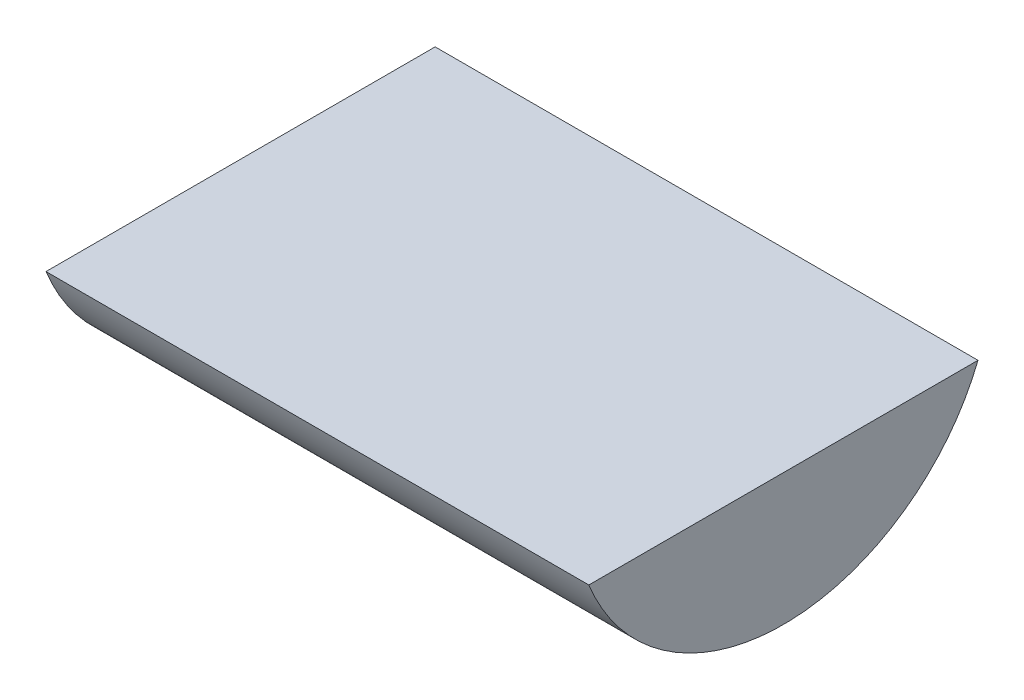
ISO-10303-21;
HEADER;
FILE_DESCRIPTION(('STEP AP214'),'2;1');
FILE_NAME('part.step','',(''),(''),'','','');
FILE_SCHEMA(('AUTOMOTIVE_DESIGN { 1 0 10303 214 1 1 1 1 }'));
ENDSEC;
DATA;
#1=APPLICATION_CONTEXT('core data for automotive mechanical design processes');
#2=APPLICATION_PROTOCOL_DEFINITION('international standard','automotive_design',2000,#1);
#3=PRODUCT_CONTEXT('',#1,'mechanical');
#4=PRODUCT('Part','Part','',(#3));
#5=PRODUCT_RELATED_PRODUCT_CATEGORY('part','',(#4));
#6=PRODUCT_DEFINITION_FORMATION('','',#4);
#7=PRODUCT_DEFINITION_CONTEXT('part definition',#1,'design');
#8=PRODUCT_DEFINITION('design','',#6,#7);
#9=PRODUCT_DEFINITION_SHAPE('','',#8);
#10=(LENGTH_UNIT() NAMED_UNIT(*) SI_UNIT(.MILLI.,.METRE.));
#11=(NAMED_UNIT(*) PLANE_ANGLE_UNIT() SI_UNIT($,.RADIAN.));
#12=(NAMED_UNIT(*) SI_UNIT($,.STERADIAN.) SOLID_ANGLE_UNIT());
#13=UNCERTAINTY_MEASURE_WITH_UNIT(LENGTH_MEASURE(1.E-05),#10,'distance_accuracy_value','');
#14=(GEOMETRIC_REPRESENTATION_CONTEXT(3) GLOBAL_UNCERTAINTY_ASSIGNED_CONTEXT((#13)) GLOBAL_UNIT_ASSIGNED_CONTEXT((#10,
#11,#12)) REPRESENTATION_CONTEXT('',''));
#15=CARTESIAN_POINT('',(0.,0.,0.));
#16=DIRECTION('',(0.,0.,1.));
#17=DIRECTION('',(1.,0.,0.));
#18=AXIS2_PLACEMENT_3D('',#15,#16,#17);
#19=CARTESIAN_POINT('',(0.,5.5,0.));
#20=DIRECTION('',(0.,1.,0.));
#21=DIRECTION('',(0.,0.,1.));
#22=AXIS2_PLACEMENT_3D('',#19,#20,#21);
#23=PLANE('',#22);
#24=DIRECTION('',(-1.,0.,0.));
#25=VECTOR('',#24,1.);
#26=CARTESIAN_POINT('',(80.01,5.5,16.885418450763));
#27=LINE('',#26,#25);
#28=CARTESIAN_POINT('',(22.67,5.5,16.885418450763));
#29=VERTEX_POINT('',#28);
#30=CARTESIAN_POINT('',(0.,5.5,16.885418450763));
#31=VERTEX_POINT('',#30);
#32=EDGE_CURVE('E74',#29,#31,#27,.T.);
#33=ORIENTED_EDGE('',*,*,#32,.F.);
#34=DIRECTION('',(0.,0.,-1.));
#35=VECTOR('',#34,1.);
#36=CARTESIAN_POINT('',(22.67,5.5,17.52));
#37=LINE('',#36,#35);
#38=CARTESIAN_POINT('',(22.67,5.5,0.634581549236986));
#39=VERTEX_POINT('',#38);
#40=EDGE_CURVE('E11',#29,#39,#37,.T.);
#41=ORIENTED_EDGE('',*,*,#40,.T.);
#42=DIRECTION('',(-1.,0.,0.));
#43=VECTOR('',#42,1.);
#44=CARTESIAN_POINT('',(80.01,5.5,0.634581549236986));
#45=LINE('',#44,#43);
#46=CARTESIAN_POINT('',(0.,5.5,0.634581549236986));
#47=VERTEX_POINT('',#46);
#48=EDGE_CURVE('E49',#47,#39,#45,.F.);
#49=ORIENTED_EDGE('',*,*,#48,.F.);
#50=DIRECTION('',(0.,0.,-1.));
#51=VECTOR('',#50,1.);
#52=CARTESIAN_POINT('',(0.,5.5,17.52));
#53=LINE('',#52,#51);
#54=EDGE_CURVE('E68',#31,#47,#53,.T.);
#55=ORIENTED_EDGE('',*,*,#54,.F.);
#56=EDGE_LOOP('',(#33,#41,#49,#55));
#57=FACE_BOUND('',#56,.T.);
#58=ADVANCED_FACE('F42',(#57),#23,.T.);
#59=CARTESIAN_POINT('',(80.01,8.76,8.76));
#60=DIRECTION('',(-1.,0.,0.));
#61=DIRECTION('',(0.,0.,1.));
#62=AXIS2_PLACEMENT_3D('',#59,#60,#61);
#63=CYLINDRICAL_SURFACE('',#62,8.755);
#64=CARTESIAN_POINT('',(0.,8.76,8.76));
#65=DIRECTION('',(-1.,0.,0.));
#66=DIRECTION('',(0.,0.,1.));
#67=AXIS2_PLACEMENT_3D('',#64,#65,#66);
#68=CIRCLE('',#67,8.755);
#69=EDGE_CURVE('E72',#47,#31,#68,.T.);
#70=ORIENTED_EDGE('',*,*,#69,.F.);
#71=ORIENTED_EDGE('',*,*,#48,.T.);
#72=CARTESIAN_POINT('',(22.67,8.76,8.76));
#73=DIRECTION('',(-1.,0.,0.));
#74=DIRECTION('',(0.,0.,1.));
#75=AXIS2_PLACEMENT_3D('',#72,#73,#74);
#76=CIRCLE('',#75,8.755);
#77=EDGE_CURVE('E55',#39,#29,#76,.T.);
#78=ORIENTED_EDGE('',*,*,#77,.T.);
#79=ORIENTED_EDGE('',*,*,#32,.T.);
#80=EDGE_LOOP('',(#70,#71,#78,#79));
#81=FACE_BOUND('',#80,.T.);
#82=ADVANCED_FACE('F76',(#81),#63,.T.);
#83=CARTESIAN_POINT('',(0.,0.,17.52));
#84=DIRECTION('',(-1.,0.,0.));
#85=DIRECTION('',(0.,0.,1.));
#86=AXIS2_PLACEMENT_3D('',#83,#84,#85);
#87=PLANE('',#86);
#88=ORIENTED_EDGE('',*,*,#69,.T.);
#89=ORIENTED_EDGE('',*,*,#54,.T.);
#90=EDGE_LOOP('',(#88,#89));
#91=FACE_BOUND('',#90,.T.);
#92=ADVANCED_FACE('F70',(#91),#87,.T.);
#93=CARTESIAN_POINT('',(22.67,0.,17.52));
#94=DIRECTION('',(-1.,0.,0.));
#95=DIRECTION('',(0.,0.,1.));
#96=AXIS2_PLACEMENT_3D('',#93,#94,#95);
#97=PLANE('',#96);
#98=ORIENTED_EDGE('',*,*,#40,.F.);
#99=ORIENTED_EDGE('',*,*,#77,.F.);
#100=EDGE_LOOP('',(#98,#99));
#101=FACE_BOUND('',#100,.T.);
#102=ADVANCED_FACE('F80',(#101),#97,.F.);
#103=CLOSED_SHELL('',(#58,#82,#92,#102));
#104=MANIFOLD_SOLID_BREP('B2',#103);
#105=ADVANCED_BREP_SHAPE_REPRESENTATION('',(#18,#104),#14);
#106=SHAPE_DEFINITION_REPRESENTATION(#9,#105);
ENDSEC;
END-ISO-10303-21;
